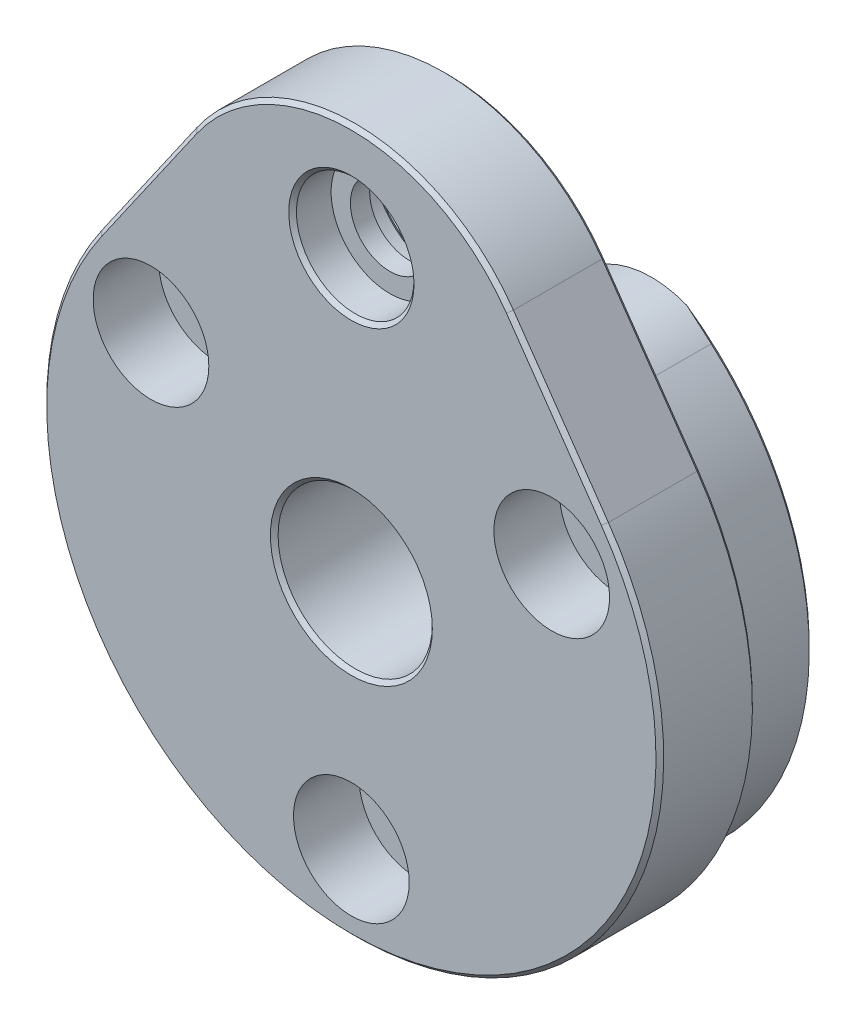
ISO-10303-21;
HEADER;
FILE_DESCRIPTION(('STEP AP214'),'2;1');
FILE_NAME('part.step','',(''),(''),'','','');
FILE_SCHEMA(('AUTOMOTIVE_DESIGN { 1 0 10303 214 1 1 1 1 }'));
ENDSEC;
DATA;
#1=APPLICATION_CONTEXT('core data for automotive mechanical design processes');
#2=APPLICATION_PROTOCOL_DEFINITION('international standard','automotive_design',2000,#1);
#3=PRODUCT_CONTEXT('',#1,'mechanical');
#4=PRODUCT('Part','Part','',(#3));
#5=PRODUCT_RELATED_PRODUCT_CATEGORY('part','',(#4));
#6=PRODUCT_DEFINITION_FORMATION('','',#4);
#7=PRODUCT_DEFINITION_CONTEXT('part definition',#1,'design');
#8=PRODUCT_DEFINITION('design','',#6,#7);
#9=PRODUCT_DEFINITION_SHAPE('','',#8);
#10=(LENGTH_UNIT() NAMED_UNIT(*) SI_UNIT(.MILLI.,.METRE.));
#11=(NAMED_UNIT(*) PLANE_ANGLE_UNIT() SI_UNIT($,.RADIAN.));
#12=(NAMED_UNIT(*) SI_UNIT($,.STERADIAN.) SOLID_ANGLE_UNIT());
#13=UNCERTAINTY_MEASURE_WITH_UNIT(LENGTH_MEASURE(1.E-05),#10,'distance_accuracy_value','');
#14=(GEOMETRIC_REPRESENTATION_CONTEXT(3) GLOBAL_UNCERTAINTY_ASSIGNED_CONTEXT((#13)) GLOBAL_UNIT_ASSIGNED_CONTEXT((#10,
#11,#12)) REPRESENTATION_CONTEXT('',''));
#15=CARTESIAN_POINT('',(0.,0.,0.));
#16=DIRECTION('',(0.,0.,1.));
#17=DIRECTION('',(1.,0.,0.));
#18=AXIS2_PLACEMENT_3D('',#15,#16,#17);
#19=CARTESIAN_POINT('',(0.,15.,5.));
#20=DIRECTION('',(0.,0.,-1.));
#21=DIRECTION('',(-1.,0.,0.));
#22=AXIS2_PLACEMENT_3D('',#19,#20,#21);
#23=CYLINDRICAL_SURFACE('',#22,2.05);
#24=CARTESIAN_POINT('',(0.,15.,2.));
#25=DIRECTION('',(0.,0.,-1.));
#26=DIRECTION('',(-1.,0.,0.));
#27=AXIS2_PLACEMENT_3D('',#24,#25,#26);
#28=CIRCLE('',#27,2.05);
#29=CARTESIAN_POINT('',(-2.05,15.,2.));
#30=VERTEX_POINT('',#29);
#31=EDGE_CURVE('E170',#30,#30,#28,.T.);
#32=ORIENTED_EDGE('',*,*,#31,.T.);
#33=EDGE_LOOP('',(#32));
#34=FACE_BOUND('',#33,.T.);
#35=CARTESIAN_POINT('',(0.,15.,3.));
#36=DIRECTION('',(0.,0.,1.));
#37=DIRECTION('',(1.,0.,0.));
#38=AXIS2_PLACEMENT_3D('',#35,#36,#37);
#39=CIRCLE('',#38,2.05);
#40=CARTESIAN_POINT('',(2.05,15.,3.));
#41=VERTEX_POINT('',#40);
#42=EDGE_CURVE('E161',#41,#41,#39,.T.);
#43=ORIENTED_EDGE('',*,*,#42,.T.);
#44=EDGE_LOOP('',(#43));
#45=FACE_BOUND('',#44,.T.);
#46=ADVANCED_FACE('F43',(#34,#45),#23,.F.);
#47=CARTESIAN_POINT('',(0.,0.,5.));
#48=DIRECTION('',(0.,0.,1.));
#49=DIRECTION('',(1.,0.,0.));
#50=AXIS2_PLACEMENT_3D('',#47,#48,#49);
#51=PLANE('',#50);
#52=CARTESIAN_POINT('',(0.,15.,5.));
#53=DIRECTION('',(0.,0.,1.));
#54=DIRECTION('',(1.,0.,0.));
#55=AXIS2_PLACEMENT_3D('',#52,#53,#54);
#56=CIRCLE('',#55,3.25);
#57=CARTESIAN_POINT('',(3.25,15.,5.));
#58=VERTEX_POINT('',#57);
#59=EDGE_CURVE('E577',#58,#58,#56,.F.);
#60=ORIENTED_EDGE('',*,*,#59,.T.);
#61=EDGE_LOOP('',(#60));
#62=FACE_BOUND('',#61,.T.);
#63=DIRECTION('',(-0.571428571428572,0.82065180664829,0.));
#64=VECTOR('',#63,1.);
#65=CARTESIAN_POINT('',(8.04238770515324,16.1,5.));
#66=LINE('',#65,#64);
#67=CARTESIAN_POINT('',(12.966298545043,9.02857142857145,5.));
#68=VERTEX_POINT('',#67);
#69=CARTESIAN_POINT('',(8.04238770515324,16.1,5.));
#70=VERTEX_POINT('',#69);
#71=EDGE_CURVE('E268',#68,#70,#66,.T.);
#72=ORIENTED_EDGE('',*,*,#71,.T.);
#73=CARTESIAN_POINT('',(0.,10.5,5.));
#74=DIRECTION('',(0.,0.,1.));
#75=DIRECTION('',(1.,0.,0.));
#76=AXIS2_PLACEMENT_3D('',#73,#74,#75);
#77=CIRCLE('',#76,9.80000000000001);
#78=CARTESIAN_POINT('',(-8.04238770515324,16.1,5.));
#79=VERTEX_POINT('',#78);
#80=EDGE_CURVE('E272',#70,#79,#77,.T.);
#81=ORIENTED_EDGE('',*,*,#80,.T.);
#82=DIRECTION('',(-0.571428571428572,-0.82065180664829,0.));
#83=VECTOR('',#82,1.);
#84=CARTESIAN_POINT('',(-12.966298545043,9.02857142857145,5.));
#85=LINE('',#84,#83);
#86=CARTESIAN_POINT('',(-12.966298545043,9.02857142857145,5.));
#87=VERTEX_POINT('',#86);
#88=EDGE_CURVE('E270',#79,#87,#85,.T.);
#89=ORIENTED_EDGE('',*,*,#88,.T.);
#90=CARTESIAN_POINT('',(0.,0.,5.));
#91=DIRECTION('',(0.,0.,1.));
#92=DIRECTION('',(1.,0.,0.));
#93=AXIS2_PLACEMENT_3D('',#90,#91,#92);
#94=CIRCLE('',#93,15.8);
#95=EDGE_CURVE('E266',#87,#68,#94,.T.);
#96=ORIENTED_EDGE('',*,*,#95,.T.);
#97=EDGE_LOOP('',(#72,#81,#89,#96));
#98=FACE_BOUND('',#97,.T.);
#99=CARTESIAN_POINT('',(0.,0.,5.));
#100=DIRECTION('',(0.,0.,1.));
#101=DIRECTION('',(1.,0.,0.));
#102=AXIS2_PLACEMENT_3D('',#99,#100,#101);
#103=CIRCLE('',#102,4.2);
#104=CARTESIAN_POINT('',(4.2,0.,5.));
#105=VERTEX_POINT('',#104);
#106=EDGE_CURVE('E263',#105,#105,#103,.F.);
#107=ORIENTED_EDGE('',*,*,#106,.T.);
#108=EDGE_LOOP('',(#107));
#109=FACE_BOUND('',#108,.T.);
#110=CARTESIAN_POINT('',(0.,-12.,5.));
#111=DIRECTION('',(0.,0.,1.));
#112=DIRECTION('',(1.,0.,0.));
#113=AXIS2_PLACEMENT_3D('',#110,#111,#112);
#114=CIRCLE('',#113,3.);
#115=CARTESIAN_POINT('',(3.,-12.,5.));
#116=VERTEX_POINT('',#115);
#117=EDGE_CURVE('E176',#116,#116,#114,.T.);
#118=ORIENTED_EDGE('',*,*,#117,.F.);
#119=EDGE_LOOP('',(#118));
#120=FACE_BOUND('',#119,.T.);
#121=CARTESIAN_POINT('',(-10.3923048454132,6.00000000000005,5.));
#122=DIRECTION('',(0.,0.,1.));
#123=DIRECTION('',(1.,0.,0.));
#124=AXIS2_PLACEMENT_3D('',#121,#122,#123);
#125=CIRCLE('',#124,3.);
#126=CARTESIAN_POINT('',(-7.39230484541323,6.00000000000005,5.));
#127=VERTEX_POINT('',#126);
#128=EDGE_CURVE('E188',#127,#127,#125,.T.);
#129=ORIENTED_EDGE('',*,*,#128,.F.);
#130=EDGE_LOOP('',(#129));
#131=FACE_BOUND('',#130,.T.);
#132=CARTESIAN_POINT('',(10.3923048454133,5.9999999999999,5.));
#133=DIRECTION('',(0.,0.,1.));
#134=DIRECTION('',(1.,0.,0.));
#135=AXIS2_PLACEMENT_3D('',#132,#133,#134);
#136=CIRCLE('',#135,3.);
#137=CARTESIAN_POINT('',(13.3923048454133,5.9999999999999,5.));
#138=VERTEX_POINT('',#137);
#139=EDGE_CURVE('E200',#138,#138,#136,.T.);
#140=ORIENTED_EDGE('',*,*,#139,.F.);
#141=EDGE_LOOP('',(#140));
#142=FACE_BOUND('',#141,.T.);
#143=ADVANCED_FACE('F357',(#62,#98,#109,#120,#131,#142),#51,.T.);
#144=CARTESIAN_POINT('',(0.,0.,0.));
#145=DIRECTION('',(0.,0.,1.));
#146=DIRECTION('',(1.,0.,0.));
#147=AXIS2_PLACEMENT_3D('',#144,#145,#146);
#148=PLANE('',#147);
#149=CARTESIAN_POINT('',(0.,15.,0.));
#150=DIRECTION('',(0.,0.,1.));
#151=DIRECTION('',(1.,0.,0.));
#152=AXIS2_PLACEMENT_3D('',#149,#150,#151);
#153=CIRCLE('',#152,3.95);
#154=CARTESIAN_POINT('',(3.95,15.,0.));
#155=VERTEX_POINT('',#154);
#156=EDGE_CURVE('E11',#155,#155,#153,.T.);
#157=ORIENTED_EDGE('',*,*,#156,.T.);
#158=EDGE_LOOP('',(#157));
#159=FACE_BOUND('',#158,.T.);
#160=DIRECTION('',(0.571428571428572,-0.82065180664829,0.));
#161=VECTOR('',#160,1.);
#162=CARTESIAN_POINT('',(12.966298545043,9.02857142857145,0.));
#163=LINE('',#162,#161);
#164=CARTESIAN_POINT('',(8.04238770515326,16.1,0.));
#165=VERTEX_POINT('',#164);
#166=CARTESIAN_POINT('',(12.966298545043,9.02857142857146,0.));
#167=VERTEX_POINT('',#166);
#168=EDGE_CURVE('E243',#165,#167,#163,.T.);
#169=ORIENTED_EDGE('',*,*,#168,.T.);
#170=CARTESIAN_POINT('',(0.,0.,0.));
#171=DIRECTION('',(0.,0.,1.));
#172=DIRECTION('',(1.,0.,0.));
#173=AXIS2_PLACEMENT_3D('',#170,#171,#172);
#174=CIRCLE('',#173,15.8);
#175=CARTESIAN_POINT('',(-12.966298545043,9.02857142857146,0.));
#176=VERTEX_POINT('',#175);
#177=EDGE_CURVE('E247',#167,#176,#174,.F.);
#178=ORIENTED_EDGE('',*,*,#177,.T.);
#179=DIRECTION('',(0.571428571428572,0.82065180664829,0.));
#180=VECTOR('',#179,1.);
#181=CARTESIAN_POINT('',(-12.966298545043,9.02857142857146,0.));
#182=LINE('',#181,#180);
#183=CARTESIAN_POINT('',(-8.04238770515325,16.1,0.));
#184=VERTEX_POINT('',#183);
#185=EDGE_CURVE('E245',#176,#184,#182,.T.);
#186=ORIENTED_EDGE('',*,*,#185,.T.);
#187=CARTESIAN_POINT('',(0.,10.5,0.));
#188=DIRECTION('',(0.,0.,1.));
#189=DIRECTION('',(1.,0.,0.));
#190=AXIS2_PLACEMENT_3D('',#187,#188,#189);
#191=CIRCLE('',#190,9.80000000000002);
#192=EDGE_CURVE('E241',#184,#165,#191,.F.);
#193=ORIENTED_EDGE('',*,*,#192,.T.);
#194=EDGE_LOOP('',(#169,#178,#186,#193));
#195=FACE_BOUND('',#194,.T.);
#196=CARTESIAN_POINT('',(0.,0.,0.));
#197=DIRECTION('',(0.,0.,-1.));
#198=DIRECTION('',(-1.,0.,0.));
#199=AXIS2_PLACEMENT_3D('',#196,#197,#198);
#200=CIRCLE('',#199,14.95);
#201=CARTESIAN_POINT('',(9.86339463036539,11.2345870580845,0.));
#202=VERTEX_POINT('',#201);
#203=CARTESIAN_POINT('',(-9.98416271008041,11.1273983921957,0.));
#204=VERTEX_POINT('',#203);
#205=EDGE_CURVE('E213',#202,#204,#200,.T.);
#206=ORIENTED_EDGE('',*,*,#205,.F.);
#207=CARTESIAN_POINT('',(6.56460043960774,7.47720008213649,0.));
#208=DIRECTION('',(0.,0.,1.));
#209=DIRECTION('',(1.,0.,0.));
#210=AXIS2_PLACEMENT_3D('',#207,#208,#209);
#211=CIRCLE('',#210,5.);
#212=CARTESIAN_POINT('',(3.24193134319928,11.2134910338388,0.));
#213=VERTEX_POINT('',#212);
#214=EDGE_CURVE('E66',#202,#213,#211,.T.);
#215=ORIENTED_EDGE('',*,*,#214,.T.);
#216=CARTESIAN_POINT('',(-0.0807377532091798,14.949781985541,0.));
#217=DIRECTION('',(0.,0.,1.));
#218=DIRECTION('',(1.,0.,0.));
#219=AXIS2_PLACEMENT_3D('',#216,#217,#218);
#220=CIRCLE('',#219,5.);
#221=CARTESIAN_POINT('',(-3.36285780520994,11.1778212269627,0.));
#222=VERTEX_POINT('',#221);
#223=EDGE_CURVE('E173',#213,#222,#220,.F.);
#224=ORIENTED_EDGE('',*,*,#223,.T.);
#225=CARTESIAN_POINT('',(-6.64497785721071,7.40586046838444,0.));
#226=DIRECTION('',(0.,0.,1.));
#227=DIRECTION('',(1.,0.,0.));
#228=AXIS2_PLACEMENT_3D('',#225,#226,#227);
#229=CIRCLE('',#228,5.);
#230=EDGE_CURVE('E585',#222,#204,#229,.T.);
#231=ORIENTED_EDGE('',*,*,#230,.T.);
#232=EDGE_LOOP('',(#206,#215,#224,#231));
#233=FACE_BOUND('',#232,.T.);
#234=ADVANCED_FACE('F364',(#159,#195,#233),#148,.F.);
#235=CARTESIAN_POINT('',(0.,28.,5.));
#236=DIRECTION('',(0.82065180664829,-0.571428571428572,0.));
#237=DIRECTION('',(0.571428571428572,0.82065180664829,0.));
#238=AXIS2_PLACEMENT_3D('',#235,#236,#237);
#239=PLANE('',#238);
#240=DIRECTION('',(0.,0.,-1.));
#241=VECTOR('',#240,1.);
#242=CARTESIAN_POINT('',(-8.20651806648289,16.2142857142857,5.));
#243=LINE('',#242,#241);
#244=CARTESIAN_POINT('',(-8.20651806648289,16.2142857142857,4.8));
#245=VERTEX_POINT('',#244);
#246=CARTESIAN_POINT('',(-8.20651806648289,16.2142857142857,0.199999999999978));
#247=VERTEX_POINT('',#246);
#248=EDGE_CURVE('E223',#245,#247,#243,.T.);
#249=ORIENTED_EDGE('',*,*,#248,.T.);
#250=DIRECTION('',(-0.571428571428572,-0.82065180664829,0.));
#251=VECTOR('',#250,1.);
#252=CARTESIAN_POINT('',(0.,28.,0.199999999999976));
#253=LINE('',#252,#251);
#254=CARTESIAN_POINT('',(-13.1304289063726,9.14285714285716,0.199999999999976));
#255=VERTEX_POINT('',#254);
#256=EDGE_CURVE('E252',#247,#255,#253,.T.);
#257=ORIENTED_EDGE('',*,*,#256,.T.);
#258=DIRECTION('',(0.,0.,-1.));
#259=VECTOR('',#258,1.);
#260=CARTESIAN_POINT('',(-13.1304289063726,9.14285714285716,5.));
#261=LINE('',#260,#259);
#262=CARTESIAN_POINT('',(-13.1304289063726,9.14285714285716,4.8));
#263=VERTEX_POINT('',#262);
#264=EDGE_CURVE('E220',#263,#255,#261,.T.);
#265=ORIENTED_EDGE('',*,*,#264,.F.);
#266=DIRECTION('',(0.571428571428572,0.82065180664829,0.));
#267=VECTOR('',#266,1.);
#268=CARTESIAN_POINT('',(-8.20651806648289,16.2142857142857,4.8));
#269=LINE('',#268,#267);
#270=EDGE_CURVE('E250',#263,#245,#269,.T.);
#271=ORIENTED_EDGE('',*,*,#270,.T.);
#272=EDGE_LOOP('',(#249,#257,#265,#271));
#273=FACE_BOUND('',#272,.T.);
#274=ADVANCED_FACE('F373',(#273),#239,.F.);
#275=CARTESIAN_POINT('',(0.,0.,5.));
#276=DIRECTION('',(0.,0.,-1.));
#277=DIRECTION('',(-1.,0.,0.));
#278=AXIS2_PLACEMENT_3D('',#275,#276,#277);
#279=CYLINDRICAL_SURFACE('',#278,16.);
#280=ORIENTED_EDGE('',*,*,#264,.T.);
#281=CARTESIAN_POINT('',(0.,0.,0.199999999999978));
#282=DIRECTION('',(0.,0.,1.));
#283=DIRECTION('',(1.,0.,0.));
#284=AXIS2_PLACEMENT_3D('',#281,#282,#283);
#285=CIRCLE('',#284,16.);
#286=CARTESIAN_POINT('',(13.1304289063726,9.14285714285716,0.199999999999978));
#287=VERTEX_POINT('',#286);
#288=EDGE_CURVE('E238',#255,#287,#285,.T.);
#289=ORIENTED_EDGE('',*,*,#288,.T.);
#290=DIRECTION('',(0.,0.,-1.));
#291=VECTOR('',#290,1.);
#292=CARTESIAN_POINT('',(13.1304289063726,9.14285714285716,5.));
#293=LINE('',#292,#291);
#294=CARTESIAN_POINT('',(13.1304289063726,9.14285714285716,4.8));
#295=VERTEX_POINT('',#294);
#296=EDGE_CURVE('E212',#295,#287,#293,.T.);
#297=ORIENTED_EDGE('',*,*,#296,.F.);
#298=CARTESIAN_POINT('',(0.,0.,4.8));
#299=DIRECTION('',(0.,0.,1.));
#300=DIRECTION('',(1.,0.,0.));
#301=AXIS2_PLACEMENT_3D('',#298,#299,#300);
#302=CIRCLE('',#301,16.);
#303=EDGE_CURVE('E236',#295,#263,#302,.F.);
#304=ORIENTED_EDGE('',*,*,#303,.T.);
#305=EDGE_LOOP('',(#280,#289,#297,#304));
#306=FACE_BOUND('',#305,.T.);
#307=ADVANCED_FACE('F378',(#306),#279,.T.);
#308=CARTESIAN_POINT('',(0.,28.,5.));
#309=DIRECTION('',(-0.82065180664829,-0.571428571428572,0.));
#310=DIRECTION('',(0.571428571428572,-0.82065180664829,0.));
#311=AXIS2_PLACEMENT_3D('',#308,#309,#310);
#312=PLANE('',#311);
#313=ORIENTED_EDGE('',*,*,#296,.T.);
#314=DIRECTION('',(-0.571428571428572,0.82065180664829,0.));
#315=VECTOR('',#314,1.);
#316=CARTESIAN_POINT('',(0.,28.,0.199999999999978));
#317=LINE('',#316,#315);
#318=CARTESIAN_POINT('',(8.2065180664829,16.2142857142857,0.199999999999978));
#319=VERTEX_POINT('',#318);
#320=EDGE_CURVE('E256',#287,#319,#317,.T.);
#321=ORIENTED_EDGE('',*,*,#320,.T.);
#322=DIRECTION('',(0.,0.,-1.));
#323=VECTOR('',#322,1.);
#324=CARTESIAN_POINT('',(8.2065180664829,16.2142857142857,5.));
#325=LINE('',#324,#323);
#326=CARTESIAN_POINT('',(8.2065180664829,16.2142857142857,4.8));
#327=VERTEX_POINT('',#326);
#328=EDGE_CURVE('E217',#319,#327,#325,.F.);
#329=ORIENTED_EDGE('',*,*,#328,.T.);
#330=DIRECTION('',(0.571428571428572,-0.82065180664829,0.));
#331=VECTOR('',#330,1.);
#332=CARTESIAN_POINT('',(13.1304289063726,9.14285714285716,4.8));
#333=LINE('',#332,#331);
#334=EDGE_CURVE('E254',#327,#295,#333,.T.);
#335=ORIENTED_EDGE('',*,*,#334,.T.);
#336=EDGE_LOOP('',(#313,#321,#329,#335));
#337=FACE_BOUND('',#336,.T.);
#338=ADVANCED_FACE('F375',(#337),#312,.F.);
#339=CARTESIAN_POINT('',(0.,0.,5.));
#340=DIRECTION('',(0.,0.,-1.));
#341=DIRECTION('',(-1.,0.,0.));
#342=AXIS2_PLACEMENT_3D('',#339,#340,#341);
#343=CYLINDRICAL_SURFACE('',#342,4.);
#344=CARTESIAN_POINT('',(0.,0.,4.8));
#345=DIRECTION('',(0.,0.,1.));
#346=DIRECTION('',(1.,0.,0.));
#347=AXIS2_PLACEMENT_3D('',#344,#345,#346);
#348=CIRCLE('',#347,4.);
#349=CARTESIAN_POINT('',(4.,0.,4.8));
#350=VERTEX_POINT('',#349);
#351=EDGE_CURVE('E278',#350,#350,#348,.T.);
#352=ORIENTED_EDGE('',*,*,#351,.T.);
#353=EDGE_LOOP('',(#352));
#354=FACE_BOUND('',#353,.T.);
#355=CARTESIAN_POINT('',(0.,0.,-3.8));
#356=DIRECTION('',(0.,0.,-1.));
#357=DIRECTION('',(-1.,0.,0.));
#358=AXIS2_PLACEMENT_3D('',#355,#356,#357);
#359=CIRCLE('',#358,4.);
#360=CARTESIAN_POINT('',(-4.,0.,-3.8));
#361=VERTEX_POINT('',#360);
#362=EDGE_CURVE('E275',#361,#361,#359,.T.);
#363=ORIENTED_EDGE('',*,*,#362,.T.);
#364=EDGE_LOOP('',(#363));
#365=FACE_BOUND('',#364,.T.);
#366=ADVANCED_FACE('F369',(#354,#365),#343,.F.);
#367=CARTESIAN_POINT('',(0.,10.5,5.));
#368=DIRECTION('',(0.,0.,-1.));
#369=DIRECTION('',(-1.,0.,0.));
#370=AXIS2_PLACEMENT_3D('',#367,#368,#369);
#371=CYLINDRICAL_SURFACE('',#370,10.);
#372=ORIENTED_EDGE('',*,*,#328,.F.);
#373=CARTESIAN_POINT('',(0.,10.5,0.199999999999979));
#374=DIRECTION('',(0.,0.,1.));
#375=DIRECTION('',(1.,0.,0.));
#376=AXIS2_PLACEMENT_3D('',#373,#374,#375);
#377=CIRCLE('',#376,10.);
#378=EDGE_CURVE('E261',#319,#247,#377,.T.);
#379=ORIENTED_EDGE('',*,*,#378,.T.);
#380=ORIENTED_EDGE('',*,*,#248,.F.);
#381=CARTESIAN_POINT('',(0.,10.5,4.8));
#382=DIRECTION('',(0.,0.,1.));
#383=DIRECTION('',(1.,0.,0.));
#384=AXIS2_PLACEMENT_3D('',#381,#382,#383);
#385=CIRCLE('',#384,10.);
#386=EDGE_CURVE('E258',#245,#327,#385,.F.);
#387=ORIENTED_EDGE('',*,*,#386,.T.);
#388=EDGE_LOOP('',(#372,#379,#380,#387));
#389=FACE_BOUND('',#388,.T.);
#390=ADVANCED_FACE('F385',(#389),#371,.T.);
#391=CARTESIAN_POINT('',(0.,0.,-4.));
#392=DIRECTION('',(0.,0.,-1.));
#393=DIRECTION('',(-1.,0.,0.));
#394=AXIS2_PLACEMENT_3D('',#391,#392,#393);
#395=PLANE('',#394);
#396=CARTESIAN_POINT('',(-10.3923048454133,-5.99999999999997,-4.));
#397=DIRECTION('',(0.,0.,-1.));
#398=DIRECTION('',(-1.,0.,0.));
#399=AXIS2_PLACEMENT_3D('',#396,#397,#398);
#400=CIRCLE('',#399,1.49999999999999);
#401=CARTESIAN_POINT('',(-11.8923048454133,-5.99999999999997,-4.));
#402=VERTEX_POINT('',#401);
#403=EDGE_CURVE('E155',#402,#402,#400,.T.);
#404=ORIENTED_EDGE('',*,*,#403,.F.);
#405=EDGE_LOOP('',(#404));
#406=FACE_BOUND('',#405,.T.);
#407=CARTESIAN_POINT('',(10.3923048454133,-5.99999999999998,-4.));
#408=DIRECTION('',(0.,0.,-1.));
#409=DIRECTION('',(-1.,0.,0.));
#410=AXIS2_PLACEMENT_3D('',#407,#408,#409);
#411=CIRCLE('',#410,1.49999999999999);
#412=CARTESIAN_POINT('',(8.89230484541329,-5.99999999999998,-4.));
#413=VERTEX_POINT('',#412);
#414=EDGE_CURVE('E154',#413,#413,#411,.T.);
#415=ORIENTED_EDGE('',*,*,#414,.F.);
#416=EDGE_LOOP('',(#415));
#417=FACE_BOUND('',#416,.T.);
#418=CARTESIAN_POINT('',(0.,0.,-4.));
#419=DIRECTION('',(0.,0.,-1.));
#420=DIRECTION('',(-1.,0.,0.));
#421=AXIS2_PLACEMENT_3D('',#418,#419,#420);
#422=CIRCLE('',#421,4.2);
#423=CARTESIAN_POINT('',(-4.2,0.,-4.));
#424=VERTEX_POINT('',#423);
#425=EDGE_CURVE('E216',#424,#424,#422,.F.);
#426=ORIENTED_EDGE('',*,*,#425,.T.);
#427=EDGE_LOOP('',(#426));
#428=FACE_BOUND('',#427,.T.);
#429=CARTESIAN_POINT('',(0.,0.,-4.));
#430=DIRECTION('',(0.,0.,-1.));
#431=DIRECTION('',(-1.,0.,0.));
#432=AXIS2_PLACEMENT_3D('',#429,#430,#431);
#433=CIRCLE('',#432,14.75);
#434=CARTESIAN_POINT('',(8.3876627953309,12.1329968611148,-4.));
#435=VERTEX_POINT('',#434);
#436=CARTESIAN_POINT('',(-8.51822057246953,12.0416949919335,-4.));
#437=VERTEX_POINT('',#436);
#438=EDGE_CURVE('E230',#435,#437,#433,.T.);
#439=ORIENTED_EDGE('',*,*,#438,.T.);
#440=CARTESIAN_POINT('',(-6.64497785721071,7.40586046838444,-4.));
#441=DIRECTION('',(0.,0.,-1.));
#442=DIRECTION('',(-1.,0.,0.));
#443=AXIS2_PLACEMENT_3D('',#440,#441,#442);
#444=CIRCLE('',#443,5.);
#445=CARTESIAN_POINT('',(-3.36285780520994,11.1778212269627,-4.));
#446=VERTEX_POINT('',#445);
#447=EDGE_CURVE('E591',#437,#446,#444,.T.);
#448=ORIENTED_EDGE('',*,*,#447,.T.);
#449=CARTESIAN_POINT('',(-0.0807377532091798,14.949781985541,-4.));
#450=DIRECTION('',(0.,0.,-1.));
#451=DIRECTION('',(-1.,0.,0.));
#452=AXIS2_PLACEMENT_3D('',#449,#450,#451);
#453=CIRCLE('',#452,5.);
#454=CARTESIAN_POINT('',(3.24193134319928,11.2134910338388,-4.));
#455=VERTEX_POINT('',#454);
#456=EDGE_CURVE('E171',#455,#446,#453,.T.);
#457=ORIENTED_EDGE('',*,*,#456,.F.);
#458=CARTESIAN_POINT('',(6.56460043960774,7.47720008213649,-4.));
#459=DIRECTION('',(0.,0.,-1.));
#460=DIRECTION('',(-1.,0.,0.));
#461=AXIS2_PLACEMENT_3D('',#458,#459,#460);
#462=CIRCLE('',#461,5.);
#463=EDGE_CURVE('E592',#455,#435,#462,.T.);
#464=ORIENTED_EDGE('',*,*,#463,.T.);
#465=EDGE_LOOP('',(#439,#448,#457,#464));
#466=FACE_BOUND('',#465,.T.);
#467=CARTESIAN_POINT('',(0.,-12.,-4.));
#468=DIRECTION('',(0.,0.,-1.));
#469=DIRECTION('',(-1.,0.,0.));
#470=AXIS2_PLACEMENT_3D('',#467,#468,#469);
#471=CIRCLE('',#470,1.6);
#472=CARTESIAN_POINT('',(-1.6,-12.,-4.));
#473=VERTEX_POINT('',#472);
#474=EDGE_CURVE('E185',#473,#473,#471,.T.);
#475=ORIENTED_EDGE('',*,*,#474,.F.);
#476=EDGE_LOOP('',(#475));
#477=FACE_BOUND('',#476,.T.);
#478=CARTESIAN_POINT('',(-10.3923048454132,6.00000000000005,-4.));
#479=DIRECTION('',(0.,0.,-1.));
#480=DIRECTION('',(-1.,0.,0.));
#481=AXIS2_PLACEMENT_3D('',#478,#479,#480);
#482=CIRCLE('',#481,1.6);
#483=CARTESIAN_POINT('',(-11.9923048454132,6.00000000000005,-4.));
#484=VERTEX_POINT('',#483);
#485=EDGE_CURVE('E197',#484,#484,#482,.T.);
#486=ORIENTED_EDGE('',*,*,#485,.F.);
#487=EDGE_LOOP('',(#486));
#488=FACE_BOUND('',#487,.T.);
#489=CARTESIAN_POINT('',(10.3923048454133,5.9999999999999,-4.));
#490=DIRECTION('',(0.,0.,-1.));
#491=DIRECTION('',(-1.,0.,0.));
#492=AXIS2_PLACEMENT_3D('',#489,#490,#491);
#493=CIRCLE('',#492,1.6);
#494=CARTESIAN_POINT('',(8.79230484541332,5.9999999999999,-4.));
#495=VERTEX_POINT('',#494);
#496=EDGE_CURVE('E209',#495,#495,#493,.T.);
#497=ORIENTED_EDGE('',*,*,#496,.F.);
#498=EDGE_LOOP('',(#497));
#499=FACE_BOUND('',#498,.T.);
#500=ADVANCED_FACE('F387',(#406,#417,#428,#466,#477,#488,#499),#395,.T.);
#501=CARTESIAN_POINT('',(0.,0.,-4.));
#502=DIRECTION('',(0.,0.,1.));
#503=DIRECTION('',(1.,0.,0.));
#504=AXIS2_PLACEMENT_3D('',#501,#502,#503);
#505=CYLINDRICAL_SURFACE('',#504,14.95);
#506=ORIENTED_EDGE('',*,*,#205,.T.);
#507=DIRECTION('',(0.,0.,1.));
#508=VECTOR('',#507,1.);
#509=CARTESIAN_POINT('',(-9.98416271008041,11.1273983921957,-4.));
#510=LINE('',#509,#508);
#511=CARTESIAN_POINT('',(-9.98416271008041,11.1273983921957,-3.80000000000002));
#512=VERTEX_POINT('',#511);
#513=EDGE_CURVE('E305',#204,#512,#510,.F.);
#514=ORIENTED_EDGE('',*,*,#513,.T.);
#515=CARTESIAN_POINT('',(0.,0.,-3.80000000000002));
#516=DIRECTION('',(0.,0.,-1.));
#517=DIRECTION('',(-1.,0.,0.));
#518=AXIS2_PLACEMENT_3D('',#515,#516,#517);
#519=CIRCLE('',#518,14.95);
#520=CARTESIAN_POINT('',(9.86339463036539,11.2345870580845,-3.80000000000002));
#521=VERTEX_POINT('',#520);
#522=EDGE_CURVE('E233',#512,#521,#519,.F.);
#523=ORIENTED_EDGE('',*,*,#522,.T.);
#524=DIRECTION('',(0.,0.,1.));
#525=VECTOR('',#524,1.);
#526=CARTESIAN_POINT('',(9.86339463036539,11.2345870580845,-4.));
#527=LINE('',#526,#525);
#528=EDGE_CURVE('E281',#521,#202,#527,.T.);
#529=ORIENTED_EDGE('',*,*,#528,.T.);
#530=EDGE_LOOP('',(#506,#514,#523,#529));
#531=FACE_BOUND('',#530,.T.);
#532=ADVANCED_FACE('F394',(#531),#505,.T.);
#533=CARTESIAN_POINT('',(10.3923048454133,5.9999999999999,5.));
#534=DIRECTION('',(0.,0.,1.));
#535=DIRECTION('',(1.,0.,0.));
#536=AXIS2_PLACEMENT_3D('',#533,#534,#535);
#537=CYLINDRICAL_SURFACE('',#536,1.6);
#538=CARTESIAN_POINT('',(10.3923048454133,5.9999999999999,1.6));
#539=DIRECTION('',(0.,0.,1.));
#540=DIRECTION('',(1.,0.,0.));
#541=AXIS2_PLACEMENT_3D('',#538,#539,#540);
#542=CIRCLE('',#541,1.6);
#543=CARTESIAN_POINT('',(11.9923048454133,5.9999999999999,1.6));
#544=VERTEX_POINT('',#543);
#545=EDGE_CURVE('E206',#544,#544,#542,.T.);
#546=ORIENTED_EDGE('',*,*,#545,.T.);
#547=EDGE_LOOP('',(#546));
#548=FACE_BOUND('',#547,.T.);
#549=ORIENTED_EDGE('',*,*,#496,.T.);
#550=EDGE_LOOP('',(#549));
#551=FACE_BOUND('',#550,.T.);
#552=ADVANCED_FACE('F506',(#548,#551),#537,.F.);
#553=CARTESIAN_POINT('',(11.9923048454133,5.9999999999999,1.6));
#554=DIRECTION('',(0.,0.,-1.));
#555=DIRECTION('',(-1.,0.,0.));
#556=AXIS2_PLACEMENT_3D('',#553,#554,#555);
#557=PLANE('',#556);
#558=ORIENTED_EDGE('',*,*,#545,.F.);
#559=EDGE_LOOP('',(#558));
#560=FACE_BOUND('',#559,.T.);
#561=CARTESIAN_POINT('',(10.3923048454133,5.9999999999999,1.6));
#562=DIRECTION('',(0.,0.,1.));
#563=DIRECTION('',(1.,0.,0.));
#564=AXIS2_PLACEMENT_3D('',#561,#562,#563);
#565=CIRCLE('',#564,3.);
#566=CARTESIAN_POINT('',(13.3923048454133,5.9999999999999,1.6));
#567=VERTEX_POINT('',#566);
#568=EDGE_CURVE('E203',#567,#567,#565,.T.);
#569=ORIENTED_EDGE('',*,*,#568,.T.);
#570=EDGE_LOOP('',(#569));
#571=FACE_BOUND('',#570,.T.);
#572=ADVANCED_FACE('F508',(#560,#571),#557,.F.);
#573=CARTESIAN_POINT('',(10.3923048454133,5.9999999999999,5.));
#574=DIRECTION('',(0.,0.,1.));
#575=DIRECTION('',(1.,0.,0.));
#576=AXIS2_PLACEMENT_3D('',#573,#574,#575);
#577=CYLINDRICAL_SURFACE('',#576,3.);
#578=ORIENTED_EDGE('',*,*,#568,.F.);
#579=EDGE_LOOP('',(#578));
#580=FACE_BOUND('',#579,.T.);
#581=ORIENTED_EDGE('',*,*,#139,.T.);
#582=EDGE_LOOP('',(#581));
#583=FACE_BOUND('',#582,.T.);
#584=ADVANCED_FACE('F514',(#580,#583),#577,.F.);
#585=CARTESIAN_POINT('',(-10.3923048454132,6.00000000000005,5.));
#586=DIRECTION('',(0.,0.,1.));
#587=DIRECTION('',(1.,0.,0.));
#588=AXIS2_PLACEMENT_3D('',#585,#586,#587);
#589=CYLINDRICAL_SURFACE('',#588,1.6);
#590=CARTESIAN_POINT('',(-10.3923048454132,6.00000000000005,1.6));
#591=DIRECTION('',(0.,0.,1.));
#592=DIRECTION('',(1.,0.,0.));
#593=AXIS2_PLACEMENT_3D('',#590,#591,#592);
#594=CIRCLE('',#593,1.6);
#595=CARTESIAN_POINT('',(-8.79230484541323,6.00000000000005,1.6));
#596=VERTEX_POINT('',#595);
#597=EDGE_CURVE('E194',#596,#596,#594,.T.);
#598=ORIENTED_EDGE('',*,*,#597,.T.);
#599=EDGE_LOOP('',(#598));
#600=FACE_BOUND('',#599,.T.);
#601=ORIENTED_EDGE('',*,*,#485,.T.);
#602=EDGE_LOOP('',(#601));
#603=FACE_BOUND('',#602,.T.);
#604=ADVANCED_FACE('F522',(#600,#603),#589,.F.);
#605=CARTESIAN_POINT('',(-8.79230484541323,6.00000000000005,1.6));
#606=DIRECTION('',(0.,0.,-1.));
#607=DIRECTION('',(-1.,0.,0.));
#608=AXIS2_PLACEMENT_3D('',#605,#606,#607);
#609=PLANE('',#608);
#610=ORIENTED_EDGE('',*,*,#597,.F.);
#611=EDGE_LOOP('',(#610));
#612=FACE_BOUND('',#611,.T.);
#613=CARTESIAN_POINT('',(-10.3923048454132,6.00000000000005,1.6));
#614=DIRECTION('',(0.,0.,1.));
#615=DIRECTION('',(1.,0.,0.));
#616=AXIS2_PLACEMENT_3D('',#613,#614,#615);
#617=CIRCLE('',#616,3.);
#618=CARTESIAN_POINT('',(-7.39230484541323,6.00000000000005,1.6));
#619=VERTEX_POINT('',#618);
#620=EDGE_CURVE('E191',#619,#619,#617,.T.);
#621=ORIENTED_EDGE('',*,*,#620,.T.);
#622=EDGE_LOOP('',(#621));
#623=FACE_BOUND('',#622,.T.);
#624=ADVANCED_FACE('F526',(#612,#623),#609,.F.);
#625=CARTESIAN_POINT('',(-10.3923048454132,6.00000000000005,5.));
#626=DIRECTION('',(0.,0.,1.));
#627=DIRECTION('',(1.,0.,0.));
#628=AXIS2_PLACEMENT_3D('',#625,#626,#627);
#629=CYLINDRICAL_SURFACE('',#628,3.);
#630=ORIENTED_EDGE('',*,*,#620,.F.);
#631=EDGE_LOOP('',(#630));
#632=FACE_BOUND('',#631,.T.);
#633=ORIENTED_EDGE('',*,*,#128,.T.);
#634=EDGE_LOOP('',(#633));
#635=FACE_BOUND('',#634,.T.);
#636=ADVANCED_FACE('F530',(#632,#635),#629,.F.);
#637=CARTESIAN_POINT('',(0.,-12.,5.));
#638=DIRECTION('',(0.,0.,1.));
#639=DIRECTION('',(1.,0.,0.));
#640=AXIS2_PLACEMENT_3D('',#637,#638,#639);
#641=CYLINDRICAL_SURFACE('',#640,1.6);
#642=CARTESIAN_POINT('',(0.,-12.,1.6));
#643=DIRECTION('',(0.,0.,1.));
#644=DIRECTION('',(1.,0.,0.));
#645=AXIS2_PLACEMENT_3D('',#642,#643,#644);
#646=CIRCLE('',#645,1.6);
#647=CARTESIAN_POINT('',(1.6,-12.,1.6));
#648=VERTEX_POINT('',#647);
#649=EDGE_CURVE('E182',#648,#648,#646,.T.);
#650=ORIENTED_EDGE('',*,*,#649,.T.);
#651=EDGE_LOOP('',(#650));
#652=FACE_BOUND('',#651,.T.);
#653=ORIENTED_EDGE('',*,*,#474,.T.);
#654=EDGE_LOOP('',(#653));
#655=FACE_BOUND('',#654,.T.);
#656=ADVANCED_FACE('F534',(#652,#655),#641,.F.);
#657=CARTESIAN_POINT('',(1.6,-12.,1.6));
#658=DIRECTION('',(0.,0.,-1.));
#659=DIRECTION('',(-1.,0.,0.));
#660=AXIS2_PLACEMENT_3D('',#657,#658,#659);
#661=PLANE('',#660);
#662=ORIENTED_EDGE('',*,*,#649,.F.);
#663=EDGE_LOOP('',(#662));
#664=FACE_BOUND('',#663,.T.);
#665=CARTESIAN_POINT('',(0.,-12.,1.6));
#666=DIRECTION('',(0.,0.,1.));
#667=DIRECTION('',(1.,0.,0.));
#668=AXIS2_PLACEMENT_3D('',#665,#666,#667);
#669=CIRCLE('',#668,3.);
#670=CARTESIAN_POINT('',(3.,-12.,1.6));
#671=VERTEX_POINT('',#670);
#672=EDGE_CURVE('E179',#671,#671,#669,.T.);
#673=ORIENTED_EDGE('',*,*,#672,.T.);
#674=EDGE_LOOP('',(#673));
#675=FACE_BOUND('',#674,.T.);
#676=ADVANCED_FACE('F538',(#664,#675),#661,.F.);
#677=CARTESIAN_POINT('',(0.,-12.,5.));
#678=DIRECTION('',(0.,0.,1.));
#679=DIRECTION('',(1.,0.,0.));
#680=AXIS2_PLACEMENT_3D('',#677,#678,#679);
#681=CYLINDRICAL_SURFACE('',#680,3.);
#682=ORIENTED_EDGE('',*,*,#672,.F.);
#683=EDGE_LOOP('',(#682));
#684=FACE_BOUND('',#683,.T.);
#685=ORIENTED_EDGE('',*,*,#117,.T.);
#686=EDGE_LOOP('',(#685));
#687=FACE_BOUND('',#686,.T.);
#688=ADVANCED_FACE('F542',(#684,#687),#681,.F.);
#689=CARTESIAN_POINT('',(-0.0807377532091798,14.949781985541,14.142135623731));
#690=DIRECTION('',(0.,0.,-1.));
#691=DIRECTION('',(-1.,0.,0.));
#692=AXIS2_PLACEMENT_3D('',#689,#690,#691);
#693=CYLINDRICAL_SURFACE('',#692,5.);
#694=ORIENTED_EDGE('',*,*,#456,.T.);
#695=DIRECTION('',(0.,0.,-1.));
#696=VECTOR('',#695,1.);
#697=CARTESIAN_POINT('',(-3.36285780520994,11.1778212269627,14.142135623731));
#698=LINE('',#697,#696);
#699=EDGE_CURVE('E59',#446,#222,#698,.F.);
#700=ORIENTED_EDGE('',*,*,#699,.T.);
#701=ORIENTED_EDGE('',*,*,#223,.F.);
#702=DIRECTION('',(0.,0.,-1.));
#703=VECTOR('',#702,1.);
#704=CARTESIAN_POINT('',(3.24193134319928,11.2134910338388,14.142135623731));
#705=LINE('',#704,#703);
#706=EDGE_CURVE('E587',#213,#455,#705,.T.);
#707=ORIENTED_EDGE('',*,*,#706,.T.);
#708=EDGE_LOOP('',(#694,#700,#701,#707));
#709=FACE_BOUND('',#708,.T.);
#710=ADVANCED_FACE('F546',(#709),#693,.F.);
#711=CARTESIAN_POINT('',(0.,0.,-4.));
#712=DIRECTION('',(0.,0.,1.));
#713=DIRECTION('',(1.,0.,0.));
#714=AXIS2_PLACEMENT_3D('',#711,#712,#713);
#715=CONICAL_SURFACE('',#714,14.75,0.785398163397444);
#716=ORIENTED_EDGE('',*,*,#522,.F.);
#717=CARTESIAN_POINT('',(-9.98416271008041,11.1273983921957,-3.80000000000002));
#718=CARTESIAN_POINT('',(-9.89438928277215,11.2079789677114,-3.79998843493516));
#719=CARTESIAN_POINT('',(-9.80167503692129,11.2852731877767,-3.80290497779325));
#720=CARTESIAN_POINT('',(-9.61111207338006,11.432833501311,-3.81451355783142));
#721=CARTESIAN_POINT('',(-9.51326194276255,11.5030976451291,-3.82320719209198));
#722=CARTESIAN_POINT('',(-9.31490018741611,11.6349834263126,-3.84609583890282));
#723=CARTESIAN_POINT('',(-9.21446059520561,11.6967301115576,-3.86019626482974));
#724=CARTESIAN_POINT('',(-9.01021000315041,11.8126105587885,-3.89374992706667));
#725=CARTESIAN_POINT('',(-8.90640104177961,11.8667488219696,-3.91319997818754));
#726=CARTESIAN_POINT('',(-8.75468242031405,11.9392721071023,-3.94499737458976));
#727=CARTESIAN_POINT('',(-8.70780724677515,11.9607902295768,-3.95527540237377));
#728=CARTESIAN_POINT('',(-8.6134286439564,12.0023666692928,-3.97686871807489));
#729=CARTESIAN_POINT('',(-8.56592350760218,12.0224191489158,-3.98818778713073));
#730=CARTESIAN_POINT('',(-8.51822057246953,12.0416949919335,-4.));
#731=B_SPLINE_CURVE_WITH_KNOTS('',3,(#717,#718,#719,#720,#721,#722,#723,#724,#725,#726,#727,
#728,#729,#730),.UNSPECIFIED.,.F.,.F.,(4,2,2,2,2,2,4),(0.,0.361778265097756,0.723656585649662,
1.07947347998833,1.43507897637566,1.59282808052379,1.75117465215249),.UNSPECIFIED.);
#732=EDGE_CURVE('E316',#512,#437,#731,.T.);
#733=ORIENTED_EDGE('',*,*,#732,.T.);
#734=ORIENTED_EDGE('',*,*,#438,.F.);
#735=CARTESIAN_POINT('',(8.3876627953309,12.1329968611148,-4.));
#736=CARTESIAN_POINT('',(8.49711930590539,12.0901581371118,-3.97300423582066));
#737=CARTESIAN_POINT('',(8.60562169362636,12.0432005905443,-3.94859031409448));
#738=CARTESIAN_POINT('',(8.81997870006866,11.9412024050383,-3.90510913690776));
#739=CARTESIAN_POINT('',(8.92583096602087,11.886154862247,-3.88604648896585));
#740=CARTESIAN_POINT('',(9.13215555886779,11.7692266155941,-3.85377967596908));
#741=CARTESIAN_POINT('',(9.2326893042528,11.7074807333667,-3.84047978543596));
#742=CARTESIAN_POINT('',(9.42946565985213,11.5767705171507,-3.81940653895932));
#743=CARTESIAN_POINT('',(9.52571157955925,11.5078118928342,-3.81162884901483));
#744=CARTESIAN_POINT('',(9.66105200671565,11.4033627767242,-3.80443723810946));
#745=CARTESIAN_POINT('',(9.70215836974841,11.370591344337,-3.80277749021752));
#746=CARTESIAN_POINT('',(9.78349308778461,11.3036233306068,-3.80055674561907));
#747=CARTESIAN_POINT('',(9.8237173988814,11.2694216950555,-3.80000005413646));
#748=CARTESIAN_POINT('',(9.86339463036539,11.2345870580845,-3.80000000000002));
#749=B_SPLINE_CURVE_WITH_KNOTS('',3,(#735,#736,#737,#738,#739,#740,#741,#742,#743,#744,#745,
#746,#747,#748),.UNSPECIFIED.,.F.,.F.,(4,2,2,2,2,2,4),(0.,0.361733608989437,0.723777726812596,
1.07955298075784,1.43504870123969,1.59280864037537,1.7511831123667),.UNSPECIFIED.);
#750=EDGE_CURVE('E308',#435,#521,#749,.T.);
#751=ORIENTED_EDGE('',*,*,#750,.T.);
#752=EDGE_LOOP('',(#716,#733,#734,#751));
#753=FACE_BOUND('',#752,.T.);
#754=ADVANCED_FACE('F324',(#753),#715,.T.);
#755=CARTESIAN_POINT('',(0.,10.5,0.));
#756=DIRECTION('',(0.,0.,1.));
#757=DIRECTION('',(1.,0.,0.));
#758=AXIS2_PLACEMENT_3D('',#755,#756,#757);
#759=CONICAL_SURFACE('',#758,9.80000000000002,0.785398163397444);
#760=DIRECTION('',(0.580288457473997,0.404061017820886,0.707106781186547));
#761=VECTOR('',#760,1.);
#762=CARTESIAN_POINT('',(8.04238770515326,16.1,0.));
#763=LINE('',#762,#761);
#764=EDGE_CURVE('E287',#165,#319,#763,.T.);
#765=ORIENTED_EDGE('',*,*,#764,.F.);
#766=ORIENTED_EDGE('',*,*,#192,.F.);
#767=DIRECTION('',(0.580288457473993,-0.404061017820887,-0.707106781186549));
#768=VECTOR('',#767,1.);
#769=CARTESIAN_POINT('',(-8.20651806648289,16.2142857142857,0.199999999999978));
#770=LINE('',#769,#768);
#771=EDGE_CURVE('E174',#247,#184,#770,.T.);
#772=ORIENTED_EDGE('',*,*,#771,.F.);
#773=ORIENTED_EDGE('',*,*,#378,.F.);
#774=EDGE_LOOP('',(#765,#766,#772,#773));
#775=FACE_BOUND('',#774,.T.);
#776=ADVANCED_FACE('F405',(#775),#759,.T.);
#777=CARTESIAN_POINT('',(0.,28.,0.199999999999978));
#778=DIRECTION('',(0.580288457473999,-0.404061017820886,0.707106781186544));
#779=DIRECTION('',(-0.571428571428572,-0.82065180664829,0.));
#780=AXIS2_PLACEMENT_3D('',#777,#778,#779);
#781=PLANE('',#780);
#782=ORIENTED_EDGE('',*,*,#771,.T.);
#783=ORIENTED_EDGE('',*,*,#185,.F.);
#784=DIRECTION('',(0.580288457473997,-0.404061017820884,-0.707106781186548));
#785=VECTOR('',#784,1.);
#786=CARTESIAN_POINT('',(-13.1304289063726,9.14285714285716,0.199999999999976));
#787=LINE('',#786,#785);
#788=EDGE_CURVE('E284',#255,#176,#787,.T.);
#789=ORIENTED_EDGE('',*,*,#788,.F.);
#790=ORIENTED_EDGE('',*,*,#256,.F.);
#791=EDGE_LOOP('',(#782,#783,#789,#790));
#792=FACE_BOUND('',#791,.T.);
#793=ADVANCED_FACE('F421',(#792),#781,.F.);
#794=CARTESIAN_POINT('',(0.,28.,0.199999999999978));
#795=DIRECTION('',(-0.580288457473995,-0.404061017820883,0.707106781186551));
#796=DIRECTION('',(-0.571428571428572,0.82065180664829,0.));
#797=AXIS2_PLACEMENT_3D('',#794,#795,#796);
#798=PLANE('',#797);
#799=ORIENTED_EDGE('',*,*,#764,.T.);
#800=ORIENTED_EDGE('',*,*,#320,.F.);
#801=DIRECTION('',(0.580288457474,0.404061017820889,0.707106781186543));
#802=VECTOR('',#801,1.);
#803=CARTESIAN_POINT('',(12.966298545043,9.02857142857146,0.));
#804=LINE('',#803,#802);
#805=EDGE_CURVE('E282',#167,#287,#804,.T.);
#806=ORIENTED_EDGE('',*,*,#805,.F.);
#807=ORIENTED_EDGE('',*,*,#168,.F.);
#808=EDGE_LOOP('',(#799,#800,#806,#807));
#809=FACE_BOUND('',#808,.T.);
#810=ADVANCED_FACE('F411',(#809),#798,.F.);
#811=CARTESIAN_POINT('',(0.,0.,0.199999999999978));
#812=DIRECTION('',(0.,0.,1.));
#813=DIRECTION('',(1.,0.,0.));
#814=AXIS2_PLACEMENT_3D('',#811,#812,#813);
#815=CONICAL_SURFACE('',#814,16.,0.785398163397448);
#816=ORIENTED_EDGE('',*,*,#788,.T.);
#817=ORIENTED_EDGE('',*,*,#177,.F.);
#818=ORIENTED_EDGE('',*,*,#805,.T.);
#819=ORIENTED_EDGE('',*,*,#288,.F.);
#820=EDGE_LOOP('',(#816,#817,#818,#819));
#821=FACE_BOUND('',#820,.T.);
#822=ADVANCED_FACE('F416',(#821),#815,.T.);
#823=CARTESIAN_POINT('',(0.,0.,5.));
#824=DIRECTION('',(0.,0.,-1.));
#825=DIRECTION('',(-1.,0.,0.));
#826=AXIS2_PLACEMENT_3D('',#823,#824,#825);
#827=CONICAL_SURFACE('',#826,15.8,0.785398163397422);
#828=DIRECTION('',(0.580288457473979,-0.404061017820874,0.707106781186568));
#829=VECTOR('',#828,1.);
#830=CARTESIAN_POINT('',(-13.1304289063726,9.14285714285716,4.8));
#831=LINE('',#830,#829);
#832=EDGE_CURVE('E296',#263,#87,#831,.T.);
#833=ORIENTED_EDGE('',*,*,#832,.F.);
#834=ORIENTED_EDGE('',*,*,#303,.F.);
#835=DIRECTION('',(0.580288457473982,0.404061017820878,-0.707106781186564));
#836=VECTOR('',#835,1.);
#837=CARTESIAN_POINT('',(12.966298545043,9.02857142857145,5.));
#838=LINE('',#837,#836);
#839=EDGE_CURVE('E285',#68,#295,#838,.T.);
#840=ORIENTED_EDGE('',*,*,#839,.F.);
#841=ORIENTED_EDGE('',*,*,#95,.F.);
#842=EDGE_LOOP('',(#833,#834,#840,#841));
#843=FACE_BOUND('',#842,.T.);
#844=ADVANCED_FACE('F428',(#843),#827,.T.);
#845=CARTESIAN_POINT('',(12.966298545043,9.02857142857144,5.));
#846=DIRECTION('',(0.580288457474005,0.40406101782089,0.707106781186538));
#847=DIRECTION('',(0.571428571428572,-0.82065180664829,0.));
#848=AXIS2_PLACEMENT_3D('',#845,#846,#847);
#849=PLANE('',#848);
#850=ORIENTED_EDGE('',*,*,#839,.T.);
#851=ORIENTED_EDGE('',*,*,#334,.F.);
#852=DIRECTION('',(0.58028845747399,0.404061017820875,-0.707106781186559));
#853=VECTOR('',#852,1.);
#854=CARTESIAN_POINT('',(8.04238770515324,16.1,5.));
#855=LINE('',#854,#853);
#856=EDGE_CURVE('E294',#70,#327,#855,.T.);
#857=ORIENTED_EDGE('',*,*,#856,.F.);
#858=ORIENTED_EDGE('',*,*,#71,.F.);
#859=EDGE_LOOP('',(#850,#851,#857,#858));
#860=FACE_BOUND('',#859,.T.);
#861=ADVANCED_FACE('F434',(#860),#849,.T.);
#862=CARTESIAN_POINT('',(-12.966298545043,9.02857142857145,5.));
#863=DIRECTION('',(-0.58028845747401,0.404061017820893,0.707106781186532));
#864=DIRECTION('',(0.571428571428572,0.82065180664829,0.));
#865=AXIS2_PLACEMENT_3D('',#862,#863,#864);
#866=PLANE('',#865);
#867=ORIENTED_EDGE('',*,*,#832,.T.);
#868=ORIENTED_EDGE('',*,*,#88,.F.);
#869=DIRECTION('',(0.580288457473982,-0.404061017820878,0.707106781186564));
#870=VECTOR('',#869,1.);
#871=CARTESIAN_POINT('',(-8.20651806648289,16.2142857142857,4.8));
#872=LINE('',#871,#870);
#873=EDGE_CURVE('E292',#245,#79,#872,.T.);
#874=ORIENTED_EDGE('',*,*,#873,.F.);
#875=ORIENTED_EDGE('',*,*,#270,.F.);
#876=EDGE_LOOP('',(#867,#868,#874,#875));
#877=FACE_BOUND('',#876,.T.);
#878=ADVANCED_FACE('F441',(#877),#866,.T.);
#879=CARTESIAN_POINT('',(0.,10.5,5.));
#880=DIRECTION('',(0.,0.,-1.));
#881=DIRECTION('',(-1.,0.,0.));
#882=AXIS2_PLACEMENT_3D('',#879,#880,#881);
#883=CONICAL_SURFACE('',#882,9.80000000000001,0.785398163397435);
#884=ORIENTED_EDGE('',*,*,#856,.T.);
#885=ORIENTED_EDGE('',*,*,#386,.F.);
#886=ORIENTED_EDGE('',*,*,#873,.T.);
#887=ORIENTED_EDGE('',*,*,#80,.F.);
#888=EDGE_LOOP('',(#884,#885,#886,#887));
#889=FACE_BOUND('',#888,.T.);
#890=ADVANCED_FACE('F444',(#889),#883,.T.);
#891=CARTESIAN_POINT('',(0.,0.,4.8));
#892=DIRECTION('',(0.,0.,1.));
#893=DIRECTION('',(1.,0.,0.));
#894=AXIS2_PLACEMENT_3D('',#891,#892,#893);
#895=CONICAL_SURFACE('',#894,4.,0.785398163397446);
#896=ORIENTED_EDGE('',*,*,#106,.F.);
#897=EDGE_LOOP('',(#896));
#898=FACE_BOUND('',#897,.T.);
#899=ORIENTED_EDGE('',*,*,#351,.F.);
#900=EDGE_LOOP('',(#899));
#901=FACE_BOUND('',#900,.T.);
#902=ADVANCED_FACE('F446',(#898,#901),#895,.F.);
#903=CARTESIAN_POINT('',(0.,0.,-3.8));
#904=DIRECTION('',(0.,0.,-1.));
#905=DIRECTION('',(-1.,0.,0.));
#906=AXIS2_PLACEMENT_3D('',#903,#904,#905);
#907=CONICAL_SURFACE('',#906,4.,0.785398163397444);
#908=ORIENTED_EDGE('',*,*,#425,.F.);
#909=EDGE_LOOP('',(#908));
#910=FACE_BOUND('',#909,.T.);
#911=ORIENTED_EDGE('',*,*,#362,.F.);
#912=EDGE_LOOP('',(#911));
#913=FACE_BOUND('',#912,.T.);
#914=ADVANCED_FACE('F452',(#910,#913),#907,.F.);
#915=CARTESIAN_POINT('',(0.,15.,2.));
#916=DIRECTION('',(0.,0.,-1.));
#917=DIRECTION('',(-1.,0.,0.));
#918=AXIS2_PLACEMENT_3D('',#915,#916,#917);
#919=CYLINDRICAL_SURFACE('',#918,3.75);
#920=CARTESIAN_POINT('',(0.,15.,0.199999999999995));
#921=DIRECTION('',(0.,0.,1.));
#922=DIRECTION('',(1.,0.,0.));
#923=AXIS2_PLACEMENT_3D('',#920,#921,#922);
#924=CIRCLE('',#923,3.75);
#925=CARTESIAN_POINT('',(3.75,15.,0.199999999999995));
#926=VERTEX_POINT('',#925);
#927=EDGE_CURVE('E52',#926,#926,#924,.F.);
#928=ORIENTED_EDGE('',*,*,#927,.T.);
#929=EDGE_LOOP('',(#928));
#930=FACE_BOUND('',#929,.T.);
#931=CARTESIAN_POINT('',(0.,15.,2.));
#932=DIRECTION('',(0.,0.,-1.));
#933=DIRECTION('',(-1.,0.,0.));
#934=AXIS2_PLACEMENT_3D('',#931,#932,#933);
#935=CIRCLE('',#934,3.75);
#936=CARTESIAN_POINT('',(-3.75,15.,2.));
#937=VERTEX_POINT('',#936);
#938=EDGE_CURVE('E167',#937,#937,#935,.T.);
#939=ORIENTED_EDGE('',*,*,#938,.F.);
#940=EDGE_LOOP('',(#939));
#941=FACE_BOUND('',#940,.T.);
#942=ADVANCED_FACE('F482',(#930,#941),#919,.F.);
#943=CARTESIAN_POINT('',(0.,15.,2.));
#944=DIRECTION('',(0.,0.,-1.));
#945=DIRECTION('',(-1.,0.,0.));
#946=AXIS2_PLACEMENT_3D('',#943,#944,#945);
#947=PLANE('',#946);
#948=ORIENTED_EDGE('',*,*,#31,.F.);
#949=EDGE_LOOP('',(#948));
#950=FACE_BOUND('',#949,.T.);
#951=ORIENTED_EDGE('',*,*,#938,.T.);
#952=EDGE_LOOP('',(#951));
#953=FACE_BOUND('',#952,.T.);
#954=ADVANCED_FACE('F488',(#950,#953),#947,.T.);
#955=CARTESIAN_POINT('',(-6.64497785721071,7.40586046838444,14.1421356237309));
#956=DIRECTION('',(0.,0.,1.));
#957=DIRECTION('',(1.,0.,0.));
#958=AXIS2_PLACEMENT_3D('',#955,#956,#957);
#959=CYLINDRICAL_SURFACE('',#958,5.);
#960=ORIENTED_EDGE('',*,*,#230,.F.);
#961=ORIENTED_EDGE('',*,*,#699,.F.);
#962=ORIENTED_EDGE('',*,*,#447,.F.);
#963=ORIENTED_EDGE('',*,*,#732,.F.);
#964=ORIENTED_EDGE('',*,*,#513,.F.);
#965=EDGE_LOOP('',(#960,#961,#962,#963,#964));
#966=FACE_BOUND('',#965,.T.);
#967=ADVANCED_FACE('F332',(#966),#959,.T.);
#968=CARTESIAN_POINT('',(6.56460043960774,7.47720008213649,14.1421356237309));
#969=DIRECTION('',(0.,0.,-1.));
#970=DIRECTION('',(-1.,0.,0.));
#971=AXIS2_PLACEMENT_3D('',#968,#969,#970);
#972=CYLINDRICAL_SURFACE('',#971,5.);
#973=ORIENTED_EDGE('',*,*,#463,.F.);
#974=ORIENTED_EDGE('',*,*,#706,.F.);
#975=ORIENTED_EDGE('',*,*,#214,.F.);
#976=ORIENTED_EDGE('',*,*,#528,.F.);
#977=ORIENTED_EDGE('',*,*,#750,.F.);
#978=EDGE_LOOP('',(#973,#974,#975,#976,#977));
#979=FACE_BOUND('',#978,.T.);
#980=ADVANCED_FACE('F328',(#979),#972,.T.);
#981=CARTESIAN_POINT('',(10.3923048454133,-5.99999999999998,0.));
#982=DIRECTION('',(0.,0.,-1.));
#983=DIRECTION('',(-1.,0.,0.));
#984=AXIS2_PLACEMENT_3D('',#981,#982,#983);
#985=CONICAL_SURFACE('',#984,1.49999999999999,1.02974425867665);
#986=CARTESIAN_POINT('',(10.3923048454133,-5.99999999999998,0.901290928541341));
#987=VERTEX_POINT('',#986);
#988=VERTEX_LOOP('',#987);
#989=FACE_BOUND('',#988,.T.);
#990=CARTESIAN_POINT('',(10.3923048454133,-5.99999999999998,0.));
#991=DIRECTION('',(0.,0.,-1.));
#992=DIRECTION('',(-1.,0.,0.));
#993=AXIS2_PLACEMENT_3D('',#990,#991,#992);
#994=CIRCLE('',#993,1.49999999999999);
#995=CARTESIAN_POINT('',(8.89230484541329,-5.99999999999998,0.));
#996=VERTEX_POINT('',#995);
#997=EDGE_CURVE('E158',#996,#996,#994,.T.);
#998=ORIENTED_EDGE('',*,*,#997,.T.);
#999=EDGE_LOOP('',(#998));
#1000=FACE_BOUND('',#999,.T.);
#1001=ADVANCED_FACE('F331',(#989,#1000),#985,.F.);
#1002=CARTESIAN_POINT('',(10.3923048454133,-5.99999999999998,-4.));
#1003=DIRECTION('',(0.,0.,-1.));
#1004=DIRECTION('',(-1.,0.,0.));
#1005=AXIS2_PLACEMENT_3D('',#1002,#1003,#1004);
#1006=CYLINDRICAL_SURFACE('',#1005,1.49999999999999);
#1007=ORIENTED_EDGE('',*,*,#997,.F.);
#1008=EDGE_LOOP('',(#1007));
#1009=FACE_BOUND('',#1008,.T.);
#1010=ORIENTED_EDGE('',*,*,#414,.T.);
#1011=EDGE_LOOP('',(#1010));
#1012=FACE_BOUND('',#1011,.T.);
#1013=ADVANCED_FACE('F148',(#1009,#1012),#1006,.F.);
#1014=CARTESIAN_POINT('',(-10.3923048454133,-5.99999999999997,0.));
#1015=DIRECTION('',(0.,0.,-1.));
#1016=DIRECTION('',(-1.,0.,0.));
#1017=AXIS2_PLACEMENT_3D('',#1014,#1015,#1016);
#1018=CONICAL_SURFACE('',#1017,1.49999999999999,1.02974425867665);
#1019=CARTESIAN_POINT('',(-10.3923048454133,-5.99999999999997,0.901290928541341));
#1020=VERTEX_POINT('',#1019);
#1021=VERTEX_LOOP('',#1020);
#1022=FACE_BOUND('',#1021,.T.);
#1023=CARTESIAN_POINT('',(-10.3923048454133,-5.99999999999997,0.));
#1024=DIRECTION('',(0.,0.,-1.));
#1025=DIRECTION('',(-1.,0.,0.));
#1026=AXIS2_PLACEMENT_3D('',#1023,#1024,#1025);
#1027=CIRCLE('',#1026,1.49999999999999);
#1028=CARTESIAN_POINT('',(-11.8923048454133,-5.99999999999997,0.));
#1029=VERTEX_POINT('',#1028);
#1030=EDGE_CURVE('E152',#1029,#1029,#1027,.T.);
#1031=ORIENTED_EDGE('',*,*,#1030,.T.);
#1032=EDGE_LOOP('',(#1031));
#1033=FACE_BOUND('',#1032,.T.);
#1034=ADVANCED_FACE('F144',(#1022,#1033),#1018,.F.);
#1035=CARTESIAN_POINT('',(-10.3923048454133,-5.99999999999997,-4.));
#1036=DIRECTION('',(0.,0.,-1.));
#1037=DIRECTION('',(-1.,0.,0.));
#1038=AXIS2_PLACEMENT_3D('',#1035,#1036,#1037);
#1039=CYLINDRICAL_SURFACE('',#1038,1.49999999999999);
#1040=ORIENTED_EDGE('',*,*,#1030,.F.);
#1041=EDGE_LOOP('',(#1040));
#1042=FACE_BOUND('',#1041,.T.);
#1043=ORIENTED_EDGE('',*,*,#403,.T.);
#1044=EDGE_LOOP('',(#1043));
#1045=FACE_BOUND('',#1044,.T.);
#1046=ADVANCED_FACE('F147',(#1042,#1045),#1039,.F.);
#1047=CARTESIAN_POINT('',(0.,15.,3.));
#1048=DIRECTION('',(0.,0.,1.));
#1049=DIRECTION('',(1.,0.,0.));
#1050=AXIS2_PLACEMENT_3D('',#1047,#1048,#1049);
#1051=CYLINDRICAL_SURFACE('',#1050,3.05);
#1052=CARTESIAN_POINT('',(0.,15.,4.79999999999999));
#1053=DIRECTION('',(0.,0.,1.));
#1054=DIRECTION('',(1.,0.,0.));
#1055=AXIS2_PLACEMENT_3D('',#1052,#1053,#1054);
#1056=CIRCLE('',#1055,3.05);
#1057=CARTESIAN_POINT('',(3.05,15.,4.79999999999999));
#1058=VERTEX_POINT('',#1057);
#1059=EDGE_CURVE('E565',#1058,#1058,#1056,.T.);
#1060=ORIENTED_EDGE('',*,*,#1059,.T.);
#1061=EDGE_LOOP('',(#1060));
#1062=FACE_BOUND('',#1061,.T.);
#1063=CARTESIAN_POINT('',(0.,15.,3.));
#1064=DIRECTION('',(0.,0.,1.));
#1065=DIRECTION('',(1.,0.,0.));
#1066=AXIS2_PLACEMENT_3D('',#1063,#1064,#1065);
#1067=CIRCLE('',#1066,3.05);
#1068=CARTESIAN_POINT('',(3.05,15.,3.));
#1069=VERTEX_POINT('',#1068);
#1070=EDGE_CURVE('E568',#1069,#1069,#1067,.T.);
#1071=ORIENTED_EDGE('',*,*,#1070,.F.);
#1072=EDGE_LOOP('',(#1071));
#1073=FACE_BOUND('',#1072,.T.);
#1074=ADVANCED_FACE('F351',(#1062,#1073),#1051,.F.);
#1075=CARTESIAN_POINT('',(0.,15.,3.));
#1076=DIRECTION('',(0.,0.,1.));
#1077=DIRECTION('',(1.,0.,0.));
#1078=AXIS2_PLACEMENT_3D('',#1075,#1076,#1077);
#1079=PLANE('',#1078);
#1080=ORIENTED_EDGE('',*,*,#42,.F.);
#1081=EDGE_LOOP('',(#1080));
#1082=FACE_BOUND('',#1081,.T.);
#1083=ORIENTED_EDGE('',*,*,#1070,.T.);
#1084=EDGE_LOOP('',(#1083));
#1085=FACE_BOUND('',#1084,.T.);
#1086=ADVANCED_FACE('F342',(#1082,#1085),#1079,.T.);
#1087=CARTESIAN_POINT('',(0.,15.,4.79999999999999));
#1088=DIRECTION('',(0.,0.,1.));
#1089=DIRECTION('',(1.,0.,0.));
#1090=AXIS2_PLACEMENT_3D('',#1087,#1088,#1089);
#1091=CONICAL_SURFACE('',#1090,3.05,0.785398163397442);
#1092=ORIENTED_EDGE('',*,*,#59,.F.);
#1093=EDGE_LOOP('',(#1092));
#1094=FACE_BOUND('',#1093,.T.);
#1095=ORIENTED_EDGE('',*,*,#1059,.F.);
#1096=EDGE_LOOP('',(#1095));
#1097=FACE_BOUND('',#1096,.T.);
#1098=ADVANCED_FACE('F337',(#1094,#1097),#1091,.F.);
#1099=CARTESIAN_POINT('',(0.,15.,0.199999999999995));
#1100=DIRECTION('',(0.,0.,-1.));
#1101=DIRECTION('',(-1.,0.,0.));
#1102=AXIS2_PLACEMENT_3D('',#1099,#1100,#1101);
#1103=CONICAL_SURFACE('',#1102,3.75,0.785398163397467);
#1104=ORIENTED_EDGE('',*,*,#156,.F.);
#1105=EDGE_LOOP('',(#1104));
#1106=FACE_BOUND('',#1105,.T.);
#1107=ORIENTED_EDGE('',*,*,#927,.F.);
#1108=EDGE_LOOP('',(#1107));
#1109=FACE_BOUND('',#1108,.T.);
#1110=ADVANCED_FACE('F46',(#1106,#1109),#1103,.F.);
#1111=CLOSED_SHELL('',(#46,#143,#234,#274,#307,#338,#366,#390,#500,#532,#552,#572,#584,#604,
#624,#636,#656,#676,#688,#710,#754,#776,#793,#810,#822,#844,#861,#878,#890,#902,#914,#942,#954,
#967,#980,#1001,#1013,#1034,#1046,#1074,#1086,#1098,#1110));
#1112=MANIFOLD_SOLID_BREP('B2',#1111);
#1113=ADVANCED_BREP_SHAPE_REPRESENTATION('',(#18,#1112),#14);
#1114=SHAPE_DEFINITION_REPRESENTATION(#9,#1113);
ENDSEC;
END-ISO-10303-21;
